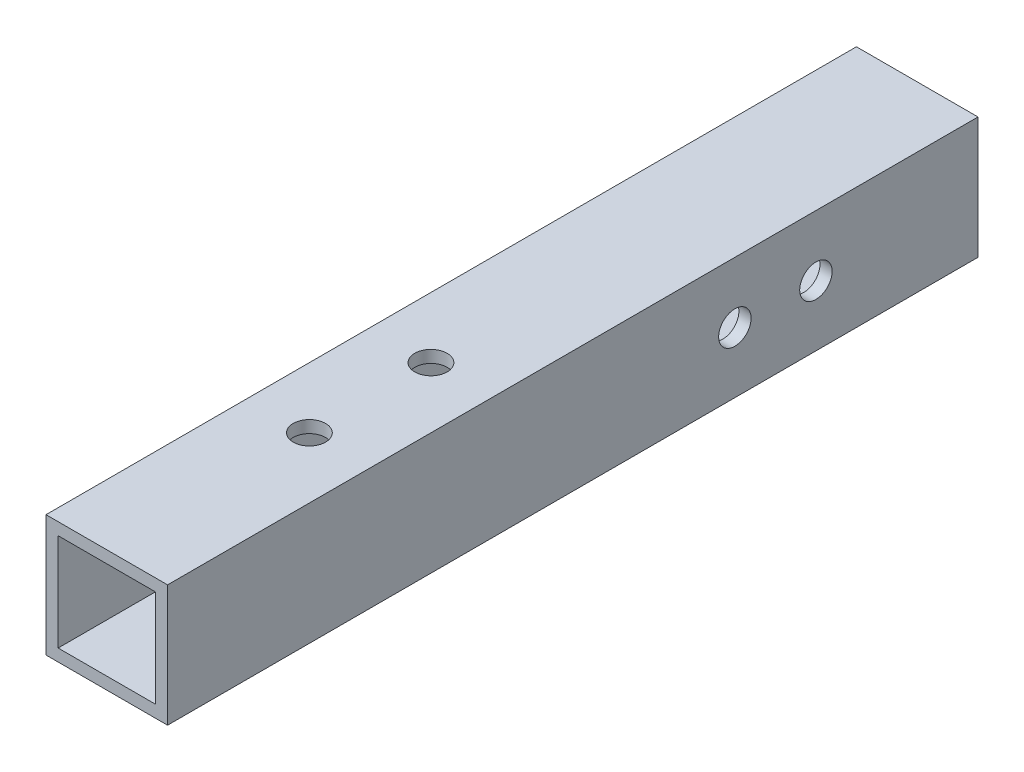
ISO-10303-21;
HEADER;
FILE_DESCRIPTION(('STEP AP214'),'2;1');
FILE_NAME('part.step','',(''),(''),'','','');
FILE_SCHEMA(('AUTOMOTIVE_DESIGN { 1 0 10303 214 1 1 1 1 }'));
ENDSEC;
DATA;
#1=APPLICATION_CONTEXT('core data for automotive mechanical design processes');
#2=APPLICATION_PROTOCOL_DEFINITION('international standard','automotive_design',2000,#1);
#3=PRODUCT_CONTEXT('',#1,'mechanical');
#4=PRODUCT('Part','Part','',(#3));
#5=PRODUCT_RELATED_PRODUCT_CATEGORY('part','',(#4));
#6=PRODUCT_DEFINITION_FORMATION('','',#4);
#7=PRODUCT_DEFINITION_CONTEXT('part definition',#1,'design');
#8=PRODUCT_DEFINITION('design','',#6,#7);
#9=PRODUCT_DEFINITION_SHAPE('','',#8);
#10=(LENGTH_UNIT() NAMED_UNIT(*) SI_UNIT(.MILLI.,.METRE.));
#11=(NAMED_UNIT(*) PLANE_ANGLE_UNIT() SI_UNIT($,.RADIAN.));
#12=(NAMED_UNIT(*) SI_UNIT($,.STERADIAN.) SOLID_ANGLE_UNIT());
#13=UNCERTAINTY_MEASURE_WITH_UNIT(LENGTH_MEASURE(1.E-05),#10,'distance_accuracy_value','');
#14=(GEOMETRIC_REPRESENTATION_CONTEXT(3) GLOBAL_UNCERTAINTY_ASSIGNED_CONTEXT((#13)) GLOBAL_UNIT_ASSIGNED_CONTEXT((#10,
#11,#12)) REPRESENTATION_CONTEXT('',''));
#15=CARTESIAN_POINT('',(0.,0.,0.));
#16=DIRECTION('',(0.,0.,1.));
#17=DIRECTION('',(1.,0.,0.));
#18=AXIS2_PLACEMENT_3D('',#15,#16,#17);
#19=CARTESIAN_POINT('',(0.,0.,100.));
#20=DIRECTION('',(0.,0.,-1.));
#21=DIRECTION('',(-1.,0.,0.));
#22=AXIS2_PLACEMENT_3D('',#19,#20,#21);
#23=PLANE('',#22);
#24=DIRECTION('',(0.,1.,0.));
#25=VECTOR('',#24,1.);
#26=CARTESIAN_POINT('',(7.5,-7.5,100.));
#27=LINE('',#26,#25);
#28=CARTESIAN_POINT('',(7.5,-7.5,100.));
#29=VERTEX_POINT('',#28);
#30=CARTESIAN_POINT('',(7.5,7.5,100.));
#31=VERTEX_POINT('',#30);
#32=EDGE_CURVE('E138',#29,#31,#27,.T.);
#33=ORIENTED_EDGE('',*,*,#32,.T.);
#34=DIRECTION('',(-1.,0.,0.));
#35=VECTOR('',#34,1.);
#36=CARTESIAN_POINT('',(-7.5,7.5,100.));
#37=LINE('',#36,#35);
#38=CARTESIAN_POINT('',(-7.5,7.5,100.));
#39=VERTEX_POINT('',#38);
#40=EDGE_CURVE('E141',#31,#39,#37,.T.);
#41=ORIENTED_EDGE('',*,*,#40,.T.);
#42=DIRECTION('',(0.,-1.,0.));
#43=VECTOR('',#42,1.);
#44=CARTESIAN_POINT('',(-7.5,-7.5,100.));
#45=LINE('',#44,#43);
#46=CARTESIAN_POINT('',(-7.5,-7.5,100.));
#47=VERTEX_POINT('',#46);
#48=EDGE_CURVE('E144',#39,#47,#45,.T.);
#49=ORIENTED_EDGE('',*,*,#48,.T.);
#50=DIRECTION('',(1.,0.,0.));
#51=VECTOR('',#50,1.);
#52=CARTESIAN_POINT('',(-7.5,-7.5,100.));
#53=LINE('',#52,#51);
#54=EDGE_CURVE('E146',#47,#29,#53,.T.);
#55=ORIENTED_EDGE('',*,*,#54,.T.);
#56=EDGE_LOOP('',(#33,#41,#49,#55));
#57=FACE_BOUND('',#56,.T.);
#58=DIRECTION('',(0.,1.,0.));
#59=VECTOR('',#58,1.);
#60=CARTESIAN_POINT('',(6.,6.,100.));
#61=LINE('',#60,#59);
#62=CARTESIAN_POINT('',(6.,-6.,100.));
#63=VERTEX_POINT('',#62);
#64=CARTESIAN_POINT('',(6.,6.,100.));
#65=VERTEX_POINT('',#64);
#66=EDGE_CURVE('E100',#63,#65,#61,.T.);
#67=ORIENTED_EDGE('',*,*,#66,.F.);
#68=DIRECTION('',(1.,0.,0.));
#69=VECTOR('',#68,1.);
#70=CARTESIAN_POINT('',(-6.,-6.,100.));
#71=LINE('',#70,#69);
#72=CARTESIAN_POINT('',(-6.,-6.,100.));
#73=VERTEX_POINT('',#72);
#74=EDGE_CURVE('E122',#73,#63,#71,.T.);
#75=ORIENTED_EDGE('',*,*,#74,.F.);
#76=DIRECTION('',(0.,-1.,0.));
#77=VECTOR('',#76,1.);
#78=CARTESIAN_POINT('',(-6.,6.,100.));
#79=LINE('',#78,#77);
#80=CARTESIAN_POINT('',(-6.,6.,100.));
#81=VERTEX_POINT('',#80);
#82=EDGE_CURVE('E120',#81,#73,#79,.T.);
#83=ORIENTED_EDGE('',*,*,#82,.F.);
#84=DIRECTION('',(-1.,0.,0.));
#85=VECTOR('',#84,1.);
#86=CARTESIAN_POINT('',(-6.,6.,100.));
#87=LINE('',#86,#85);
#88=EDGE_CURVE('E108',#65,#81,#87,.T.);
#89=ORIENTED_EDGE('',*,*,#88,.F.);
#90=EDGE_LOOP('',(#67,#75,#83,#89));
#91=FACE_BOUND('',#90,.T.);
#92=ADVANCED_FACE('F33',(#57,#91),#23,.F.);
#93=CARTESIAN_POINT('',(0.,0.,0.));
#94=DIRECTION('',(0.,0.,-1.));
#95=DIRECTION('',(-1.,0.,0.));
#96=AXIS2_PLACEMENT_3D('',#93,#94,#95);
#97=PLANE('',#96);
#98=DIRECTION('',(0.,1.,0.));
#99=VECTOR('',#98,1.);
#100=CARTESIAN_POINT('',(7.5,-7.5,0.));
#101=LINE('',#100,#99);
#102=CARTESIAN_POINT('',(7.5,-7.5,0.));
#103=VERTEX_POINT('',#102);
#104=CARTESIAN_POINT('',(7.5,7.5,0.));
#105=VERTEX_POINT('',#104);
#106=EDGE_CURVE('E116',#103,#105,#101,.T.);
#107=ORIENTED_EDGE('',*,*,#106,.F.);
#108=DIRECTION('',(1.,0.,0.));
#109=VECTOR('',#108,1.);
#110=CARTESIAN_POINT('',(-7.5,-7.5,0.));
#111=LINE('',#110,#109);
#112=CARTESIAN_POINT('',(-7.5,-7.5,0.));
#113=VERTEX_POINT('',#112);
#114=EDGE_CURVE('E142',#113,#103,#111,.T.);
#115=ORIENTED_EDGE('',*,*,#114,.F.);
#116=DIRECTION('',(0.,-1.,0.));
#117=VECTOR('',#116,1.);
#118=CARTESIAN_POINT('',(-7.5,-7.5,0.));
#119=LINE('',#118,#117);
#120=CARTESIAN_POINT('',(-7.5,7.5,0.));
#121=VERTEX_POINT('',#120);
#122=EDGE_CURVE('E153',#121,#113,#119,.T.);
#123=ORIENTED_EDGE('',*,*,#122,.F.);
#124=DIRECTION('',(-1.,0.,0.));
#125=VECTOR('',#124,1.);
#126=CARTESIAN_POINT('',(-7.5,7.5,0.));
#127=LINE('',#126,#125);
#128=EDGE_CURVE('E151',#105,#121,#127,.T.);
#129=ORIENTED_EDGE('',*,*,#128,.F.);
#130=EDGE_LOOP('',(#107,#115,#123,#129));
#131=FACE_BOUND('',#130,.T.);
#132=DIRECTION('',(1.,0.,0.));
#133=VECTOR('',#132,1.);
#134=CARTESIAN_POINT('',(-6.,-6.,0.));
#135=LINE('',#134,#133);
#136=CARTESIAN_POINT('',(-6.,-6.,0.));
#137=VERTEX_POINT('',#136);
#138=CARTESIAN_POINT('',(6.,-6.,0.));
#139=VERTEX_POINT('',#138);
#140=EDGE_CURVE('E109',#137,#139,#135,.T.);
#141=ORIENTED_EDGE('',*,*,#140,.T.);
#142=DIRECTION('',(0.,1.,0.));
#143=VECTOR('',#142,1.);
#144=CARTESIAN_POINT('',(6.,6.,0.));
#145=LINE('',#144,#143);
#146=CARTESIAN_POINT('',(6.,6.,0.));
#147=VERTEX_POINT('',#146);
#148=EDGE_CURVE('E58',#139,#147,#145,.T.);
#149=ORIENTED_EDGE('',*,*,#148,.T.);
#150=DIRECTION('',(-1.,0.,0.));
#151=VECTOR('',#150,1.);
#152=CARTESIAN_POINT('',(-6.,6.,0.));
#153=LINE('',#152,#151);
#154=CARTESIAN_POINT('',(-6.,6.,0.));
#155=VERTEX_POINT('',#154);
#156=EDGE_CURVE('E115',#147,#155,#153,.T.);
#157=ORIENTED_EDGE('',*,*,#156,.T.);
#158=DIRECTION('',(0.,-1.,0.));
#159=VECTOR('',#158,1.);
#160=CARTESIAN_POINT('',(-6.,6.,0.));
#161=LINE('',#160,#159);
#162=EDGE_CURVE('E130',#155,#137,#161,.T.);
#163=ORIENTED_EDGE('',*,*,#162,.T.);
#164=EDGE_LOOP('',(#141,#149,#157,#163));
#165=FACE_BOUND('',#164,.T.);
#166=ADVANCED_FACE('F230',(#131,#165),#97,.T.);
#167=CARTESIAN_POINT('',(7.5,-7.5,100.));
#168=DIRECTION('',(-1.,0.,0.));
#169=DIRECTION('',(0.,0.,1.));
#170=AXIS2_PLACEMENT_3D('',#167,#168,#169);
#171=PLANE('',#170);
#172=CARTESIAN_POINT('',(7.5,0.,20.));
#173=DIRECTION('',(-1.,0.,0.));
#174=DIRECTION('',(0.,0.,1.));
#175=AXIS2_PLACEMENT_3D('',#172,#173,#174);
#176=CIRCLE('',#175,2.);
#177=CARTESIAN_POINT('',(7.5,0.,22.));
#178=VERTEX_POINT('',#177);
#179=EDGE_CURVE('E175',#178,#178,#176,.T.);
#180=ORIENTED_EDGE('',*,*,#179,.T.);
#181=EDGE_LOOP('',(#180));
#182=FACE_BOUND('',#181,.T.);
#183=CARTESIAN_POINT('',(7.5,0.,30.));
#184=DIRECTION('',(-1.,0.,0.));
#185=DIRECTION('',(0.,0.,1.));
#186=AXIS2_PLACEMENT_3D('',#183,#184,#185);
#187=CIRCLE('',#186,2.);
#188=CARTESIAN_POINT('',(7.5,0.,32.));
#189=VERTEX_POINT('',#188);
#190=EDGE_CURVE('E186',#189,#189,#187,.T.);
#191=ORIENTED_EDGE('',*,*,#190,.T.);
#192=EDGE_LOOP('',(#191));
#193=FACE_BOUND('',#192,.T.);
#194=ORIENTED_EDGE('',*,*,#106,.T.);
#195=DIRECTION('',(0.,0.,-1.));
#196=VECTOR('',#195,1.);
#197=CARTESIAN_POINT('',(7.5,7.5,100.));
#198=LINE('',#197,#196);
#199=EDGE_CURVE('E11',#31,#105,#198,.T.);
#200=ORIENTED_EDGE('',*,*,#199,.F.);
#201=ORIENTED_EDGE('',*,*,#32,.F.);
#202=DIRECTION('',(0.,0.,-1.));
#203=VECTOR('',#202,1.);
#204=CARTESIAN_POINT('',(7.5,-7.5,100.));
#205=LINE('',#204,#203);
#206=EDGE_CURVE('E148',#29,#103,#205,.T.);
#207=ORIENTED_EDGE('',*,*,#206,.T.);
#208=EDGE_LOOP('',(#194,#200,#201,#207));
#209=FACE_BOUND('',#208,.T.);
#210=ADVANCED_FACE('F35',(#182,#193,#209),#171,.F.);
#211=CARTESIAN_POINT('',(-7.5,7.5,100.));
#212=DIRECTION('',(0.,-1.,0.));
#213=DIRECTION('',(0.,0.,-1.));
#214=AXIS2_PLACEMENT_3D('',#211,#212,#213);
#215=PLANE('',#214);
#216=CARTESIAN_POINT('',(0.,7.5,60.));
#217=DIRECTION('',(0.,-1.,0.));
#218=DIRECTION('',(0.,0.,-1.));
#219=AXIS2_PLACEMENT_3D('',#216,#217,#218);
#220=CIRCLE('',#219,2.);
#221=CARTESIAN_POINT('',(0.,7.5,58.));
#222=VERTEX_POINT('',#221);
#223=EDGE_CURVE('E201',#222,#222,#220,.T.);
#224=ORIENTED_EDGE('',*,*,#223,.T.);
#225=EDGE_LOOP('',(#224));
#226=FACE_BOUND('',#225,.T.);
#227=CARTESIAN_POINT('',(0.,7.5,75.));
#228=DIRECTION('',(0.,-1.,0.));
#229=DIRECTION('',(0.,0.,-1.));
#230=AXIS2_PLACEMENT_3D('',#227,#228,#229);
#231=CIRCLE('',#230,2.);
#232=CARTESIAN_POINT('',(0.,7.5,73.));
#233=VERTEX_POINT('',#232);
#234=EDGE_CURVE('E128',#233,#233,#231,.T.);
#235=ORIENTED_EDGE('',*,*,#234,.T.);
#236=EDGE_LOOP('',(#235));
#237=FACE_BOUND('',#236,.T.);
#238=ORIENTED_EDGE('',*,*,#128,.T.);
#239=DIRECTION('',(0.,0.,-1.));
#240=VECTOR('',#239,1.);
#241=CARTESIAN_POINT('',(-7.5,7.5,100.));
#242=LINE('',#241,#240);
#243=EDGE_CURVE('E42',#39,#121,#242,.T.);
#244=ORIENTED_EDGE('',*,*,#243,.F.);
#245=ORIENTED_EDGE('',*,*,#40,.F.);
#246=ORIENTED_EDGE('',*,*,#199,.T.);
#247=EDGE_LOOP('',(#238,#244,#245,#246));
#248=FACE_BOUND('',#247,.T.);
#249=ADVANCED_FACE('F210',(#226,#237,#248),#215,.F.);
#250=CARTESIAN_POINT('',(-7.5,-7.5,100.));
#251=DIRECTION('',(1.,0.,0.));
#252=DIRECTION('',(0.,0.,-1.));
#253=AXIS2_PLACEMENT_3D('',#250,#251,#252);
#254=PLANE('',#253);
#255=CARTESIAN_POINT('',(-7.5,0.,20.));
#256=DIRECTION('',(-1.,0.,0.));
#257=DIRECTION('',(0.,0.,1.));
#258=AXIS2_PLACEMENT_3D('',#255,#256,#257);
#259=CIRCLE('',#258,2.);
#260=CARTESIAN_POINT('',(-7.5,0.,22.));
#261=VERTEX_POINT('',#260);
#262=EDGE_CURVE('E181',#261,#261,#259,.T.);
#263=ORIENTED_EDGE('',*,*,#262,.F.);
#264=EDGE_LOOP('',(#263));
#265=FACE_BOUND('',#264,.T.);
#266=CARTESIAN_POINT('',(-7.5,0.,30.));
#267=DIRECTION('',(-1.,0.,0.));
#268=DIRECTION('',(0.,0.,1.));
#269=AXIS2_PLACEMENT_3D('',#266,#267,#268);
#270=CIRCLE('',#269,2.);
#271=CARTESIAN_POINT('',(-7.5,0.,32.));
#272=VERTEX_POINT('',#271);
#273=EDGE_CURVE('E191',#272,#272,#270,.T.);
#274=ORIENTED_EDGE('',*,*,#273,.F.);
#275=EDGE_LOOP('',(#274));
#276=FACE_BOUND('',#275,.T.);
#277=ORIENTED_EDGE('',*,*,#122,.T.);
#278=DIRECTION('',(0.,0.,-1.));
#279=VECTOR('',#278,1.);
#280=CARTESIAN_POINT('',(-7.5,-7.5,100.));
#281=LINE('',#280,#279);
#282=EDGE_CURVE('E158',#47,#113,#281,.T.);
#283=ORIENTED_EDGE('',*,*,#282,.F.);
#284=ORIENTED_EDGE('',*,*,#48,.F.);
#285=ORIENTED_EDGE('',*,*,#243,.T.);
#286=EDGE_LOOP('',(#277,#283,#284,#285));
#287=FACE_BOUND('',#286,.T.);
#288=ADVANCED_FACE('F244',(#265,#276,#287),#254,.F.);
#289=CARTESIAN_POINT('',(-7.5,-7.5,100.));
#290=DIRECTION('',(0.,1.,0.));
#291=DIRECTION('',(0.,0.,1.));
#292=AXIS2_PLACEMENT_3D('',#289,#290,#291);
#293=PLANE('',#292);
#294=CARTESIAN_POINT('',(0.,-7.5,60.));
#295=DIRECTION('',(0.,-1.,0.));
#296=DIRECTION('',(0.,0.,-1.));
#297=AXIS2_PLACEMENT_3D('',#294,#295,#296);
#298=CIRCLE('',#297,2.);
#299=CARTESIAN_POINT('',(0.,-7.5,58.));
#300=VERTEX_POINT('',#299);
#301=EDGE_CURVE('E171',#300,#300,#298,.T.);
#302=ORIENTED_EDGE('',*,*,#301,.F.);
#303=EDGE_LOOP('',(#302));
#304=FACE_BOUND('',#303,.T.);
#305=CARTESIAN_POINT('',(0.,-7.5,75.));
#306=DIRECTION('',(0.,-1.,0.));
#307=DIRECTION('',(0.,0.,-1.));
#308=AXIS2_PLACEMENT_3D('',#305,#306,#307);
#309=CIRCLE('',#308,2.);
#310=CARTESIAN_POINT('',(0.,-7.5,73.));
#311=VERTEX_POINT('',#310);
#312=EDGE_CURVE('E167',#311,#311,#309,.T.);
#313=ORIENTED_EDGE('',*,*,#312,.F.);
#314=EDGE_LOOP('',(#313));
#315=FACE_BOUND('',#314,.T.);
#316=ORIENTED_EDGE('',*,*,#114,.T.);
#317=ORIENTED_EDGE('',*,*,#206,.F.);
#318=ORIENTED_EDGE('',*,*,#54,.F.);
#319=ORIENTED_EDGE('',*,*,#282,.T.);
#320=EDGE_LOOP('',(#316,#317,#318,#319));
#321=FACE_BOUND('',#320,.T.);
#322=ADVANCED_FACE('F241',(#304,#315,#321),#293,.F.);
#323=CARTESIAN_POINT('',(6.,6.,100.));
#324=DIRECTION('',(-1.,0.,0.));
#325=DIRECTION('',(0.,-1.,0.));
#326=AXIS2_PLACEMENT_3D('',#323,#324,#325);
#327=PLANE('',#326);
#328=CARTESIAN_POINT('',(6.,0.,20.));
#329=DIRECTION('',(-1.,0.,0.));
#330=DIRECTION('',(0.,-1.,0.));
#331=AXIS2_PLACEMENT_3D('',#328,#329,#330);
#332=CIRCLE('',#331,2.);
#333=CARTESIAN_POINT('',(6.,0.,22.));
#334=VERTEX_POINT('',#333);
#335=EDGE_CURVE('E194',#334,#334,#332,.T.);
#336=ORIENTED_EDGE('',*,*,#335,.F.);
#337=EDGE_LOOP('',(#336));
#338=FACE_BOUND('',#337,.T.);
#339=CARTESIAN_POINT('',(6.,0.,30.));
#340=DIRECTION('',(-1.,0.,0.));
#341=DIRECTION('',(0.,-1.,0.));
#342=AXIS2_PLACEMENT_3D('',#339,#340,#341);
#343=CIRCLE('',#342,2.);
#344=CARTESIAN_POINT('',(6.,0.,32.));
#345=VERTEX_POINT('',#344);
#346=EDGE_CURVE('E174',#345,#345,#343,.T.);
#347=ORIENTED_EDGE('',*,*,#346,.F.);
#348=EDGE_LOOP('',(#347));
#349=FACE_BOUND('',#348,.T.);
#350=ORIENTED_EDGE('',*,*,#148,.F.);
#351=DIRECTION('',(0.,0.,-1.));
#352=VECTOR('',#351,1.);
#353=CARTESIAN_POINT('',(6.,-6.,100.));
#354=LINE('',#353,#352);
#355=EDGE_CURVE('E104',#63,#139,#354,.T.);
#356=ORIENTED_EDGE('',*,*,#355,.F.);
#357=ORIENTED_EDGE('',*,*,#66,.T.);
#358=DIRECTION('',(0.,0.,-1.));
#359=VECTOR('',#358,1.);
#360=CARTESIAN_POINT('',(6.,6.,100.));
#361=LINE('',#360,#359);
#362=EDGE_CURVE('E103',#65,#147,#361,.T.);
#363=ORIENTED_EDGE('',*,*,#362,.T.);
#364=EDGE_LOOP('',(#350,#356,#357,#363));
#365=FACE_BOUND('',#364,.T.);
#366=ADVANCED_FACE('F102',(#338,#349,#365),#327,.T.);
#367=CARTESIAN_POINT('',(-6.,6.,100.));
#368=DIRECTION('',(0.,-1.,0.));
#369=DIRECTION('',(0.,0.,-1.));
#370=AXIS2_PLACEMENT_3D('',#367,#368,#369);
#371=PLANE('',#370);
#372=CARTESIAN_POINT('',(0.,6.,60.));
#373=DIRECTION('',(0.,-1.,0.));
#374=DIRECTION('',(0.,0.,-1.));
#375=AXIS2_PLACEMENT_3D('',#372,#373,#374);
#376=CIRCLE('',#375,2.);
#377=CARTESIAN_POINT('',(0.,6.,58.));
#378=VERTEX_POINT('',#377);
#379=EDGE_CURVE('E170',#378,#378,#376,.T.);
#380=ORIENTED_EDGE('',*,*,#379,.F.);
#381=EDGE_LOOP('',(#380));
#382=FACE_BOUND('',#381,.T.);
#383=CARTESIAN_POINT('',(0.,6.,75.));
#384=DIRECTION('',(0.,-1.,0.));
#385=DIRECTION('',(0.,0.,-1.));
#386=AXIS2_PLACEMENT_3D('',#383,#384,#385);
#387=CIRCLE('',#386,2.);
#388=CARTESIAN_POINT('',(0.,6.,73.));
#389=VERTEX_POINT('',#388);
#390=EDGE_CURVE('E166',#389,#389,#387,.T.);
#391=ORIENTED_EDGE('',*,*,#390,.F.);
#392=EDGE_LOOP('',(#391));
#393=FACE_BOUND('',#392,.T.);
#394=ORIENTED_EDGE('',*,*,#156,.F.);
#395=ORIENTED_EDGE('',*,*,#362,.F.);
#396=ORIENTED_EDGE('',*,*,#88,.T.);
#397=DIRECTION('',(0.,0.,-1.));
#398=VECTOR('',#397,1.);
#399=CARTESIAN_POINT('',(-6.,6.,100.));
#400=LINE('',#399,#398);
#401=EDGE_CURVE('E117',#81,#155,#400,.T.);
#402=ORIENTED_EDGE('',*,*,#401,.T.);
#403=EDGE_LOOP('',(#394,#395,#396,#402));
#404=FACE_BOUND('',#403,.T.);
#405=ADVANCED_FACE('F112',(#382,#393,#404),#371,.T.);
#406=CARTESIAN_POINT('',(-6.,6.,100.));
#407=DIRECTION('',(1.,0.,0.));
#408=DIRECTION('',(0.,1.,0.));
#409=AXIS2_PLACEMENT_3D('',#406,#407,#408);
#410=PLANE('',#409);
#411=CARTESIAN_POINT('',(-6.,0.,20.));
#412=DIRECTION('',(1.,0.,0.));
#413=DIRECTION('',(0.,1.,0.));
#414=AXIS2_PLACEMENT_3D('',#411,#412,#413);
#415=CIRCLE('',#414,2.);
#416=CARTESIAN_POINT('',(-6.,0.,22.));
#417=VERTEX_POINT('',#416);
#418=EDGE_CURVE('E37',#417,#417,#415,.T.);
#419=ORIENTED_EDGE('',*,*,#418,.F.);
#420=EDGE_LOOP('',(#419));
#421=FACE_BOUND('',#420,.T.);
#422=CARTESIAN_POINT('',(-6.,0.,30.));
#423=DIRECTION('',(1.,0.,0.));
#424=DIRECTION('',(0.,1.,0.));
#425=AXIS2_PLACEMENT_3D('',#422,#423,#424);
#426=CIRCLE('',#425,2.);
#427=CARTESIAN_POINT('',(-6.,0.,32.));
#428=VERTEX_POINT('',#427);
#429=EDGE_CURVE('E172',#428,#428,#426,.T.);
#430=ORIENTED_EDGE('',*,*,#429,.F.);
#431=EDGE_LOOP('',(#430));
#432=FACE_BOUND('',#431,.T.);
#433=ORIENTED_EDGE('',*,*,#162,.F.);
#434=ORIENTED_EDGE('',*,*,#401,.F.);
#435=ORIENTED_EDGE('',*,*,#82,.T.);
#436=DIRECTION('',(0.,0.,-1.));
#437=VECTOR('',#436,1.);
#438=CARTESIAN_POINT('',(-6.,-6.,100.));
#439=LINE('',#438,#437);
#440=EDGE_CURVE('E50',#73,#137,#439,.T.);
#441=ORIENTED_EDGE('',*,*,#440,.T.);
#442=EDGE_LOOP('',(#433,#434,#435,#441));
#443=FACE_BOUND('',#442,.T.);
#444=ADVANCED_FACE('F303',(#421,#432,#443),#410,.T.);
#445=CARTESIAN_POINT('',(-6.,-6.,100.));
#446=DIRECTION('',(0.,1.,0.));
#447=DIRECTION('',(0.,0.,1.));
#448=AXIS2_PLACEMENT_3D('',#445,#446,#447);
#449=PLANE('',#448);
#450=CARTESIAN_POINT('',(0.,-6.00000000000001,60.));
#451=DIRECTION('',(0.,1.,0.));
#452=DIRECTION('',(0.,0.,1.));
#453=AXIS2_PLACEMENT_3D('',#450,#451,#452);
#454=CIRCLE('',#453,2.);
#455=CARTESIAN_POINT('',(0.,-6.00000000000001,62.));
#456=VERTEX_POINT('',#455);
#457=EDGE_CURVE('E168',#456,#456,#454,.T.);
#458=ORIENTED_EDGE('',*,*,#457,.F.);
#459=EDGE_LOOP('',(#458));
#460=FACE_BOUND('',#459,.T.);
#461=CARTESIAN_POINT('',(0.,-6.00000000000001,75.));
#462=DIRECTION('',(0.,1.,0.));
#463=DIRECTION('',(0.,0.,1.));
#464=AXIS2_PLACEMENT_3D('',#461,#462,#463);
#465=CIRCLE('',#464,2.);
#466=CARTESIAN_POINT('',(0.,-6.00000000000001,77.));
#467=VERTEX_POINT('',#466);
#468=EDGE_CURVE('E163',#467,#467,#465,.T.);
#469=ORIENTED_EDGE('',*,*,#468,.F.);
#470=EDGE_LOOP('',(#469));
#471=FACE_BOUND('',#470,.T.);
#472=ORIENTED_EDGE('',*,*,#140,.F.);
#473=ORIENTED_EDGE('',*,*,#440,.F.);
#474=ORIENTED_EDGE('',*,*,#74,.T.);
#475=ORIENTED_EDGE('',*,*,#355,.T.);
#476=EDGE_LOOP('',(#472,#473,#474,#475));
#477=FACE_BOUND('',#476,.T.);
#478=ADVANCED_FACE('F226',(#460,#471,#477),#449,.T.);
#479=CARTESIAN_POINT('',(0.,67.5,75.));
#480=DIRECTION('',(0.,-1.,0.));
#481=DIRECTION('',(0.,0.,-1.));
#482=AXIS2_PLACEMENT_3D('',#479,#480,#481);
#483=CYLINDRICAL_SURFACE('',#482,2.);
#484=ORIENTED_EDGE('',*,*,#468,.T.);
#485=EDGE_LOOP('',(#484));
#486=FACE_BOUND('',#485,.T.);
#487=ORIENTED_EDGE('',*,*,#312,.T.);
#488=EDGE_LOOP('',(#487));
#489=FACE_BOUND('',#488,.T.);
#490=ADVANCED_FACE('F216',(#486,#489),#483,.F.);
#491=ORIENTED_EDGE('',*,*,#390,.T.);
#492=EDGE_LOOP('',(#491));
#493=FACE_BOUND('',#492,.T.);
#494=ORIENTED_EDGE('',*,*,#234,.F.);
#495=EDGE_LOOP('',(#494));
#496=FACE_BOUND('',#495,.T.);
#497=ADVANCED_FACE('F213',(#493,#496),#483,.F.);
#498=CARTESIAN_POINT('',(0.,67.5,60.));
#499=DIRECTION('',(0.,-1.,0.));
#500=DIRECTION('',(0.,0.,-1.));
#501=AXIS2_PLACEMENT_3D('',#498,#499,#500);
#502=CYLINDRICAL_SURFACE('',#501,2.);
#503=ORIENTED_EDGE('',*,*,#457,.T.);
#504=EDGE_LOOP('',(#503));
#505=FACE_BOUND('',#504,.T.);
#506=ORIENTED_EDGE('',*,*,#301,.T.);
#507=EDGE_LOOP('',(#506));
#508=FACE_BOUND('',#507,.T.);
#509=ADVANCED_FACE('F215',(#505,#508),#502,.F.);
#510=ORIENTED_EDGE('',*,*,#379,.T.);
#511=EDGE_LOOP('',(#510));
#512=FACE_BOUND('',#511,.T.);
#513=ORIENTED_EDGE('',*,*,#223,.F.);
#514=EDGE_LOOP('',(#513));
#515=FACE_BOUND('',#514,.T.);
#516=ADVANCED_FACE('F223',(#512,#515),#502,.F.);
#517=CARTESIAN_POINT('',(7.5,0.,30.));
#518=DIRECTION('',(-1.,0.,0.));
#519=DIRECTION('',(0.,0.,1.));
#520=AXIS2_PLACEMENT_3D('',#517,#518,#519);
#521=CYLINDRICAL_SURFACE('',#520,2.);
#522=CARTESIAN_POINT('',(-6.,0.,32.));
#523=CARTESIAN_POINT('',(-6.015625,0.,32.));
#524=CARTESIAN_POINT('',(-6.03125,0.,32.));
#525=CARTESIAN_POINT('',(-6.0625,0.,32.));
#526=CARTESIAN_POINT('',(-6.078125,0.,32.));
#527=CARTESIAN_POINT('',(-6.109375,0.,32.));
#528=CARTESIAN_POINT('',(-6.125,0.,32.));
#529=CARTESIAN_POINT('',(-6.15625,0.,32.));
#530=CARTESIAN_POINT('',(-6.171875,0.,32.));
#531=CARTESIAN_POINT('',(-6.203125,0.,32.));
#532=CARTESIAN_POINT('',(-6.21875,0.,32.));
#533=CARTESIAN_POINT('',(-6.25,0.,32.));
#534=CARTESIAN_POINT('',(-6.265625,0.,32.));
#535=CARTESIAN_POINT('',(-6.296875,0.,32.));
#536=CARTESIAN_POINT('',(-6.3125,0.,32.));
#537=CARTESIAN_POINT('',(-6.34375,0.,32.));
#538=CARTESIAN_POINT('',(-6.359375,0.,32.));
#539=CARTESIAN_POINT('',(-6.390625,0.,32.));
#540=CARTESIAN_POINT('',(-6.40625,0.,32.));
#541=CARTESIAN_POINT('',(-6.4375,0.,32.));
#542=CARTESIAN_POINT('',(-6.453125,0.,32.));
#543=CARTESIAN_POINT('',(-6.484375,0.,32.));
#544=CARTESIAN_POINT('',(-6.5,0.,32.));
#545=CARTESIAN_POINT('',(-6.53125,0.,32.));
#546=CARTESIAN_POINT('',(-6.546875,0.,32.));
#547=CARTESIAN_POINT('',(-6.578125,0.,32.));
#548=CARTESIAN_POINT('',(-6.59375,0.,32.));
#549=CARTESIAN_POINT('',(-6.625,0.,32.));
#550=CARTESIAN_POINT('',(-6.640625,0.,32.));
#551=CARTESIAN_POINT('',(-6.671875,0.,32.));
#552=CARTESIAN_POINT('',(-6.6875,0.,32.));
#553=CARTESIAN_POINT('',(-6.71875,0.,32.));
#554=CARTESIAN_POINT('',(-6.734375,0.,32.));
#555=CARTESIAN_POINT('',(-6.765625,0.,32.));
#556=CARTESIAN_POINT('',(-6.78125,0.,32.));
#557=CARTESIAN_POINT('',(-6.8125,0.,32.));
#558=CARTESIAN_POINT('',(-6.828125,0.,32.));
#559=CARTESIAN_POINT('',(-6.859375,0.,32.));
#560=CARTESIAN_POINT('',(-6.875,0.,32.));
#561=CARTESIAN_POINT('',(-6.90625,0.,32.));
#562=CARTESIAN_POINT('',(-6.921875,0.,32.));
#563=CARTESIAN_POINT('',(-6.953125,0.,32.));
#564=CARTESIAN_POINT('',(-6.96875,0.,32.));
#565=CARTESIAN_POINT('',(-7.,0.,32.));
#566=CARTESIAN_POINT('',(-7.015625,0.,32.));
#567=CARTESIAN_POINT('',(-7.046875,0.,32.));
#568=CARTESIAN_POINT('',(-7.0625,0.,32.));
#569=CARTESIAN_POINT('',(-7.09375,0.,32.));
#570=CARTESIAN_POINT('',(-7.109375,0.,32.));
#571=CARTESIAN_POINT('',(-7.140625,0.,32.));
#572=CARTESIAN_POINT('',(-7.15625,0.,32.));
#573=CARTESIAN_POINT('',(-7.1875,0.,32.));
#574=CARTESIAN_POINT('',(-7.203125,0.,32.));
#575=CARTESIAN_POINT('',(-7.234375,0.,32.));
#576=CARTESIAN_POINT('',(-7.25,0.,32.));
#577=CARTESIAN_POINT('',(-7.28125,0.,32.));
#578=CARTESIAN_POINT('',(-7.296875,0.,32.));
#579=CARTESIAN_POINT('',(-7.328125,0.,32.));
#580=CARTESIAN_POINT('',(-7.34375,0.,32.));
#581=CARTESIAN_POINT('',(-7.375,0.,32.));
#582=CARTESIAN_POINT('',(-7.390625,0.,32.));
#583=CARTESIAN_POINT('',(-7.421875,0.,32.));
#584=CARTESIAN_POINT('',(-7.4375,0.,32.));
#585=CARTESIAN_POINT('',(-7.46875,0.,32.));
#586=CARTESIAN_POINT('',(-7.484375,0.,32.));
#587=CARTESIAN_POINT('',(-7.5,0.,32.));
#588=B_SPLINE_CURVE_WITH_KNOTS('',3,(#522,#523,#524,#525,#526,#527,#528,#529,#530,#531,#532,
#533,#534,#535,#536,#537,#538,#539,#540,#541,#542,#543,#544,#545,#546,#547,#548,#549,#550,#551,
#552,#553,#554,#555,#556,#557,#558,#559,#560,#561,#562,#563,#564,#565,#566,#567,#568,#569,#570,
#571,#572,#573,#574,#575,#576,#577,#578,#579,#580,#581,#582,#583,#584,#585,#586,#587),
.UNSPECIFIED.,.F.,.F.,(4,2,2,2,2,2,2,2,2,2,2,2,2,2,2,2,2,2,2,2,2,2,2,2,2,2,2,2,2,2,2,2,4),(0.,
0.046875,0.0937500000000001,0.140625,0.1875,0.234375,0.28125,0.328125,0.375,0.421874999999999,
0.468749999999999,0.515624999999999,0.562499999999999,0.609374999999999,0.656249999999999,
0.703124999999999,0.749999999999999,0.796874999999999,0.843749999999999,0.890624999999999,
0.937499999999999,0.984374999999999,1.03125,1.078125,1.125,1.171875,1.21875,1.265625,1.3125,
1.359375,1.40625,1.453125,1.5),.UNSPECIFIED.);
#589=EDGE_CURVE('BSEAM256',#428,#272,#588,.T.);
#590=ORIENTED_EDGE('',*,*,#429,.T.);
#591=ORIENTED_EDGE('',*,*,#273,.T.);
#592=ORIENTED_EDGE('',*,*,#589,.T.);
#593=ORIENTED_EDGE('',*,*,#589,.F.);
#594=EDGE_LOOP('',(#590,#592,#591,#593));
#595=FACE_BOUND('',#594,.T.);
#596=ADVANCED_FACE('F256',(#595),#521,.F.);
#597=CARTESIAN_POINT('',(7.5,0.,20.));
#598=DIRECTION('',(-1.,0.,0.));
#599=DIRECTION('',(0.,0.,1.));
#600=AXIS2_PLACEMENT_3D('',#597,#598,#599);
#601=CYLINDRICAL_SURFACE('',#600,2.);
#602=CARTESIAN_POINT('',(-6.,0.,22.));
#603=CARTESIAN_POINT('',(-6.015625,0.,22.));
#604=CARTESIAN_POINT('',(-6.03125,0.,22.));
#605=CARTESIAN_POINT('',(-6.0625,0.,22.));
#606=CARTESIAN_POINT('',(-6.078125,0.,22.));
#607=CARTESIAN_POINT('',(-6.109375,0.,22.));
#608=CARTESIAN_POINT('',(-6.125,0.,22.));
#609=CARTESIAN_POINT('',(-6.15625,0.,22.));
#610=CARTESIAN_POINT('',(-6.171875,0.,22.));
#611=CARTESIAN_POINT('',(-6.203125,0.,22.));
#612=CARTESIAN_POINT('',(-6.21875,0.,22.));
#613=CARTESIAN_POINT('',(-6.25,0.,22.));
#614=CARTESIAN_POINT('',(-6.265625,0.,22.));
#615=CARTESIAN_POINT('',(-6.296875,0.,22.));
#616=CARTESIAN_POINT('',(-6.3125,0.,22.));
#617=CARTESIAN_POINT('',(-6.34375,0.,22.));
#618=CARTESIAN_POINT('',(-6.359375,0.,22.));
#619=CARTESIAN_POINT('',(-6.390625,0.,22.));
#620=CARTESIAN_POINT('',(-6.40625,0.,22.));
#621=CARTESIAN_POINT('',(-6.4375,0.,22.));
#622=CARTESIAN_POINT('',(-6.453125,0.,22.));
#623=CARTESIAN_POINT('',(-6.484375,0.,22.));
#624=CARTESIAN_POINT('',(-6.5,0.,22.));
#625=CARTESIAN_POINT('',(-6.53125,0.,22.));
#626=CARTESIAN_POINT('',(-6.546875,0.,22.));
#627=CARTESIAN_POINT('',(-6.578125,0.,22.));
#628=CARTESIAN_POINT('',(-6.59375,0.,22.));
#629=CARTESIAN_POINT('',(-6.625,0.,22.));
#630=CARTESIAN_POINT('',(-6.640625,0.,22.));
#631=CARTESIAN_POINT('',(-6.671875,0.,22.));
#632=CARTESIAN_POINT('',(-6.6875,0.,22.));
#633=CARTESIAN_POINT('',(-6.71875,0.,22.));
#634=CARTESIAN_POINT('',(-6.734375,0.,22.));
#635=CARTESIAN_POINT('',(-6.765625,0.,22.));
#636=CARTESIAN_POINT('',(-6.78125,0.,22.));
#637=CARTESIAN_POINT('',(-6.8125,0.,22.));
#638=CARTESIAN_POINT('',(-6.828125,0.,22.));
#639=CARTESIAN_POINT('',(-6.859375,0.,22.));
#640=CARTESIAN_POINT('',(-6.875,0.,22.));
#641=CARTESIAN_POINT('',(-6.90625,0.,22.));
#642=CARTESIAN_POINT('',(-6.921875,0.,22.));
#643=CARTESIAN_POINT('',(-6.953125,0.,22.));
#644=CARTESIAN_POINT('',(-6.96875,0.,22.));
#645=CARTESIAN_POINT('',(-7.,0.,22.));
#646=CARTESIAN_POINT('',(-7.015625,0.,22.));
#647=CARTESIAN_POINT('',(-7.046875,0.,22.));
#648=CARTESIAN_POINT('',(-7.0625,0.,22.));
#649=CARTESIAN_POINT('',(-7.09375,0.,22.));
#650=CARTESIAN_POINT('',(-7.109375,0.,22.));
#651=CARTESIAN_POINT('',(-7.140625,0.,22.));
#652=CARTESIAN_POINT('',(-7.15625,0.,22.));
#653=CARTESIAN_POINT('',(-7.1875,0.,22.));
#654=CARTESIAN_POINT('',(-7.203125,0.,22.));
#655=CARTESIAN_POINT('',(-7.234375,0.,22.));
#656=CARTESIAN_POINT('',(-7.25,0.,22.));
#657=CARTESIAN_POINT('',(-7.28125,0.,22.));
#658=CARTESIAN_POINT('',(-7.296875,0.,22.));
#659=CARTESIAN_POINT('',(-7.328125,0.,22.));
#660=CARTESIAN_POINT('',(-7.34375,0.,22.));
#661=CARTESIAN_POINT('',(-7.375,0.,22.));
#662=CARTESIAN_POINT('',(-7.390625,0.,22.));
#663=CARTESIAN_POINT('',(-7.421875,0.,22.));
#664=CARTESIAN_POINT('',(-7.4375,0.,22.));
#665=CARTESIAN_POINT('',(-7.46875,0.,22.));
#666=CARTESIAN_POINT('',(-7.484375,0.,22.));
#667=CARTESIAN_POINT('',(-7.5,0.,22.));
#668=B_SPLINE_CURVE_WITH_KNOTS('',3,(#602,#603,#604,#605,#606,#607,#608,#609,#610,#611,#612,
#613,#614,#615,#616,#617,#618,#619,#620,#621,#622,#623,#624,#625,#626,#627,#628,#629,#630,#631,
#632,#633,#634,#635,#636,#637,#638,#639,#640,#641,#642,#643,#644,#645,#646,#647,#648,#649,#650,
#651,#652,#653,#654,#655,#656,#657,#658,#659,#660,#661,#662,#663,#664,#665,#666,#667),
.UNSPECIFIED.,.F.,.F.,(4,2,2,2,2,2,2,2,2,2,2,2,2,2,2,2,2,2,2,2,2,2,2,2,2,2,2,2,2,2,2,2,4),(0.,
0.046875,0.0937500000000001,0.140625,0.1875,0.234375,0.28125,0.328125,0.375,0.421874999999999,
0.468749999999999,0.515624999999999,0.562499999999999,0.609374999999999,0.656249999999999,
0.703124999999999,0.749999999999999,0.796874999999999,0.843749999999999,0.890624999999999,
0.937499999999999,0.984374999999999,1.03125,1.078125,1.125,1.171875,1.21875,1.265625,1.3125,
1.359375,1.40625,1.453125,1.5),.UNSPECIFIED.);
#669=EDGE_CURVE('BSEAM261',#417,#261,#668,.T.);
#670=ORIENTED_EDGE('',*,*,#418,.T.);
#671=ORIENTED_EDGE('',*,*,#262,.T.);
#672=ORIENTED_EDGE('',*,*,#669,.T.);
#673=ORIENTED_EDGE('',*,*,#669,.F.);
#674=EDGE_LOOP('',(#670,#672,#671,#673));
#675=FACE_BOUND('',#674,.T.);
#676=ADVANCED_FACE('F261',(#675),#601,.F.);
#677=CARTESIAN_POINT('',(6.,0.,32.));
#678=CARTESIAN_POINT('',(6.015625,0.,32.));
#679=CARTESIAN_POINT('',(6.03125,0.,32.));
#680=CARTESIAN_POINT('',(6.0625,0.,32.));
#681=CARTESIAN_POINT('',(6.078125,0.,32.));
#682=CARTESIAN_POINT('',(6.109375,0.,32.));
#683=CARTESIAN_POINT('',(6.125,0.,32.));
#684=CARTESIAN_POINT('',(6.15625,0.,32.));
#685=CARTESIAN_POINT('',(6.171875,0.,32.));
#686=CARTESIAN_POINT('',(6.203125,0.,32.));
#687=CARTESIAN_POINT('',(6.21875,0.,32.));
#688=CARTESIAN_POINT('',(6.25,0.,32.));
#689=CARTESIAN_POINT('',(6.265625,0.,32.));
#690=CARTESIAN_POINT('',(6.296875,0.,32.));
#691=CARTESIAN_POINT('',(6.3125,0.,32.));
#692=CARTESIAN_POINT('',(6.34375,0.,32.));
#693=CARTESIAN_POINT('',(6.359375,0.,32.));
#694=CARTESIAN_POINT('',(6.390625,0.,32.));
#695=CARTESIAN_POINT('',(6.40625,0.,32.));
#696=CARTESIAN_POINT('',(6.4375,0.,32.));
#697=CARTESIAN_POINT('',(6.453125,0.,32.));
#698=CARTESIAN_POINT('',(6.484375,0.,32.));
#699=CARTESIAN_POINT('',(6.5,0.,32.));
#700=CARTESIAN_POINT('',(6.53125,0.,32.));
#701=CARTESIAN_POINT('',(6.546875,0.,32.));
#702=CARTESIAN_POINT('',(6.578125,0.,32.));
#703=CARTESIAN_POINT('',(6.59375,0.,32.));
#704=CARTESIAN_POINT('',(6.625,0.,32.));
#705=CARTESIAN_POINT('',(6.640625,0.,32.));
#706=CARTESIAN_POINT('',(6.671875,0.,32.));
#707=CARTESIAN_POINT('',(6.6875,0.,32.));
#708=CARTESIAN_POINT('',(6.71875,0.,32.));
#709=CARTESIAN_POINT('',(6.734375,0.,32.));
#710=CARTESIAN_POINT('',(6.765625,0.,32.));
#711=CARTESIAN_POINT('',(6.78125,0.,32.));
#712=CARTESIAN_POINT('',(6.8125,0.,32.));
#713=CARTESIAN_POINT('',(6.828125,0.,32.));
#714=CARTESIAN_POINT('',(6.859375,0.,32.));
#715=CARTESIAN_POINT('',(6.875,0.,32.));
#716=CARTESIAN_POINT('',(6.90625,0.,32.));
#717=CARTESIAN_POINT('',(6.921875,0.,32.));
#718=CARTESIAN_POINT('',(6.953125,0.,32.));
#719=CARTESIAN_POINT('',(6.96875,0.,32.));
#720=CARTESIAN_POINT('',(7.,0.,32.));
#721=CARTESIAN_POINT('',(7.015625,0.,32.));
#722=CARTESIAN_POINT('',(7.046875,0.,32.));
#723=CARTESIAN_POINT('',(7.0625,0.,32.));
#724=CARTESIAN_POINT('',(7.09375,0.,32.));
#725=CARTESIAN_POINT('',(7.109375,0.,32.));
#726=CARTESIAN_POINT('',(7.140625,0.,32.));
#727=CARTESIAN_POINT('',(7.15625,0.,32.));
#728=CARTESIAN_POINT('',(7.1875,0.,32.));
#729=CARTESIAN_POINT('',(7.203125,0.,32.));
#730=CARTESIAN_POINT('',(7.234375,0.,32.));
#731=CARTESIAN_POINT('',(7.25,0.,32.));
#732=CARTESIAN_POINT('',(7.28125,0.,32.));
#733=CARTESIAN_POINT('',(7.296875,0.,32.));
#734=CARTESIAN_POINT('',(7.328125,0.,32.));
#735=CARTESIAN_POINT('',(7.34375,0.,32.));
#736=CARTESIAN_POINT('',(7.375,0.,32.));
#737=CARTESIAN_POINT('',(7.390625,0.,32.));
#738=CARTESIAN_POINT('',(7.421875,0.,32.));
#739=CARTESIAN_POINT('',(7.4375,0.,32.));
#740=CARTESIAN_POINT('',(7.46875,0.,32.));
#741=CARTESIAN_POINT('',(7.484375,0.,32.));
#742=CARTESIAN_POINT('',(7.5,0.,32.));
#743=B_SPLINE_CURVE_WITH_KNOTS('',3,(#677,#678,#679,#680,#681,#682,#683,#684,#685,#686,#687,
#688,#689,#690,#691,#692,#693,#694,#695,#696,#697,#698,#699,#700,#701,#702,#703,#704,#705,#706,
#707,#708,#709,#710,#711,#712,#713,#714,#715,#716,#717,#718,#719,#720,#721,#722,#723,#724,#725,
#726,#727,#728,#729,#730,#731,#732,#733,#734,#735,#736,#737,#738,#739,#740,#741,#742),
.UNSPECIFIED.,.F.,.F.,(4,2,2,2,2,2,2,2,2,2,2,2,2,2,2,2,2,2,2,2,2,2,2,2,2,2,2,2,2,2,2,2,4),(0.,
0.046875,0.0937500000000001,0.140625,0.1875,0.234374999999999,0.281249999999999,
0.328124999999999,0.374999999999999,0.421875,0.46875,0.515625,0.5625,0.609375,0.65625,0.703125,
0.75,0.796875,0.84375,0.890625,0.9375,0.984375,1.03125,1.078125,1.125,1.171875,1.21875,1.265625,
1.3125,1.359375,1.40625,1.453125,1.5),.UNSPECIFIED.);
#744=EDGE_CURVE('BSEAM263',#345,#189,#743,.T.);
#745=ORIENTED_EDGE('',*,*,#346,.T.);
#746=ORIENTED_EDGE('',*,*,#190,.F.);
#747=ORIENTED_EDGE('',*,*,#744,.T.);
#748=ORIENTED_EDGE('',*,*,#744,.F.);
#749=EDGE_LOOP('',(#745,#747,#746,#748));
#750=FACE_BOUND('',#749,.T.);
#751=ADVANCED_FACE('F263',(#750),#521,.F.);
#752=CARTESIAN_POINT('',(6.,0.,22.));
#753=CARTESIAN_POINT('',(6.015625,0.,22.));
#754=CARTESIAN_POINT('',(6.03125,0.,22.));
#755=CARTESIAN_POINT('',(6.0625,0.,22.));
#756=CARTESIAN_POINT('',(6.078125,0.,22.));
#757=CARTESIAN_POINT('',(6.109375,0.,22.));
#758=CARTESIAN_POINT('',(6.125,0.,22.));
#759=CARTESIAN_POINT('',(6.15625,0.,22.));
#760=CARTESIAN_POINT('',(6.171875,0.,22.));
#761=CARTESIAN_POINT('',(6.203125,0.,22.));
#762=CARTESIAN_POINT('',(6.21875,0.,22.));
#763=CARTESIAN_POINT('',(6.25,0.,22.));
#764=CARTESIAN_POINT('',(6.265625,0.,22.));
#765=CARTESIAN_POINT('',(6.296875,0.,22.));
#766=CARTESIAN_POINT('',(6.3125,0.,22.));
#767=CARTESIAN_POINT('',(6.34375,0.,22.));
#768=CARTESIAN_POINT('',(6.359375,0.,22.));
#769=CARTESIAN_POINT('',(6.390625,0.,22.));
#770=CARTESIAN_POINT('',(6.40625,0.,22.));
#771=CARTESIAN_POINT('',(6.4375,0.,22.));
#772=CARTESIAN_POINT('',(6.453125,0.,22.));
#773=CARTESIAN_POINT('',(6.484375,0.,22.));
#774=CARTESIAN_POINT('',(6.5,0.,22.));
#775=CARTESIAN_POINT('',(6.53125,0.,22.));
#776=CARTESIAN_POINT('',(6.546875,0.,22.));
#777=CARTESIAN_POINT('',(6.578125,0.,22.));
#778=CARTESIAN_POINT('',(6.59375,0.,22.));
#779=CARTESIAN_POINT('',(6.625,0.,22.));
#780=CARTESIAN_POINT('',(6.640625,0.,22.));
#781=CARTESIAN_POINT('',(6.671875,0.,22.));
#782=CARTESIAN_POINT('',(6.6875,0.,22.));
#783=CARTESIAN_POINT('',(6.71875,0.,22.));
#784=CARTESIAN_POINT('',(6.734375,0.,22.));
#785=CARTESIAN_POINT('',(6.765625,0.,22.));
#786=CARTESIAN_POINT('',(6.78125,0.,22.));
#787=CARTESIAN_POINT('',(6.8125,0.,22.));
#788=CARTESIAN_POINT('',(6.828125,0.,22.));
#789=CARTESIAN_POINT('',(6.859375,0.,22.));
#790=CARTESIAN_POINT('',(6.875,0.,22.));
#791=CARTESIAN_POINT('',(6.90625,0.,22.));
#792=CARTESIAN_POINT('',(6.921875,0.,22.));
#793=CARTESIAN_POINT('',(6.953125,0.,22.));
#794=CARTESIAN_POINT('',(6.96875,0.,22.));
#795=CARTESIAN_POINT('',(7.,0.,22.));
#796=CARTESIAN_POINT('',(7.015625,0.,22.));
#797=CARTESIAN_POINT('',(7.046875,0.,22.));
#798=CARTESIAN_POINT('',(7.0625,0.,22.));
#799=CARTESIAN_POINT('',(7.09375,0.,22.));
#800=CARTESIAN_POINT('',(7.109375,0.,22.));
#801=CARTESIAN_POINT('',(7.140625,0.,22.));
#802=CARTESIAN_POINT('',(7.15625,0.,22.));
#803=CARTESIAN_POINT('',(7.1875,0.,22.));
#804=CARTESIAN_POINT('',(7.203125,0.,22.));
#805=CARTESIAN_POINT('',(7.234375,0.,22.));
#806=CARTESIAN_POINT('',(7.25,0.,22.));
#807=CARTESIAN_POINT('',(7.28125,0.,22.));
#808=CARTESIAN_POINT('',(7.296875,0.,22.));
#809=CARTESIAN_POINT('',(7.328125,0.,22.));
#810=CARTESIAN_POINT('',(7.34375,0.,22.));
#811=CARTESIAN_POINT('',(7.375,0.,22.));
#812=CARTESIAN_POINT('',(7.390625,0.,22.));
#813=CARTESIAN_POINT('',(7.421875,0.,22.));
#814=CARTESIAN_POINT('',(7.4375,0.,22.));
#815=CARTESIAN_POINT('',(7.46875,0.,22.));
#816=CARTESIAN_POINT('',(7.484375,0.,22.));
#817=CARTESIAN_POINT('',(7.5,0.,22.));
#818=B_SPLINE_CURVE_WITH_KNOTS('',3,(#752,#753,#754,#755,#756,#757,#758,#759,#760,#761,#762,
#763,#764,#765,#766,#767,#768,#769,#770,#771,#772,#773,#774,#775,#776,#777,#778,#779,#780,#781,
#782,#783,#784,#785,#786,#787,#788,#789,#790,#791,#792,#793,#794,#795,#796,#797,#798,#799,#800,
#801,#802,#803,#804,#805,#806,#807,#808,#809,#810,#811,#812,#813,#814,#815,#816,#817),
.UNSPECIFIED.,.F.,.F.,(4,2,2,2,2,2,2,2,2,2,2,2,2,2,2,2,2,2,2,2,2,2,2,2,2,2,2,2,2,2,2,2,4),(0.,
0.046875,0.0937500000000001,0.140625,0.1875,0.234374999999999,0.281249999999999,
0.328124999999999,0.374999999999999,0.421875,0.46875,0.515625,0.5625,0.609375,0.65625,0.703125,
0.75,0.796875,0.84375,0.890625,0.9375,0.984375,1.03125,1.078125,1.125,1.171875,1.21875,1.265625,
1.3125,1.359375,1.40625,1.453125,1.5),.UNSPECIFIED.);
#819=EDGE_CURVE('BSEAM267',#334,#178,#818,.T.);
#820=ORIENTED_EDGE('',*,*,#335,.T.);
#821=ORIENTED_EDGE('',*,*,#179,.F.);
#822=ORIENTED_EDGE('',*,*,#819,.T.);
#823=ORIENTED_EDGE('',*,*,#819,.F.);
#824=EDGE_LOOP('',(#820,#822,#821,#823));
#825=FACE_BOUND('',#824,.T.);
#826=ADVANCED_FACE('F267',(#825),#601,.F.);
#827=CLOSED_SHELL('',(#92,#166,#210,#249,#288,#322,#366,#405,#444,#478,#490,#497,#509,#516,#596,
#676,#751,#826));
#828=MANIFOLD_SOLID_BREP('B2',#827);
#829=ADVANCED_BREP_SHAPE_REPRESENTATION('',(#18,#828),#14);
#830=SHAPE_DEFINITION_REPRESENTATION(#9,#829);
ENDSEC;
END-ISO-10303-21;
